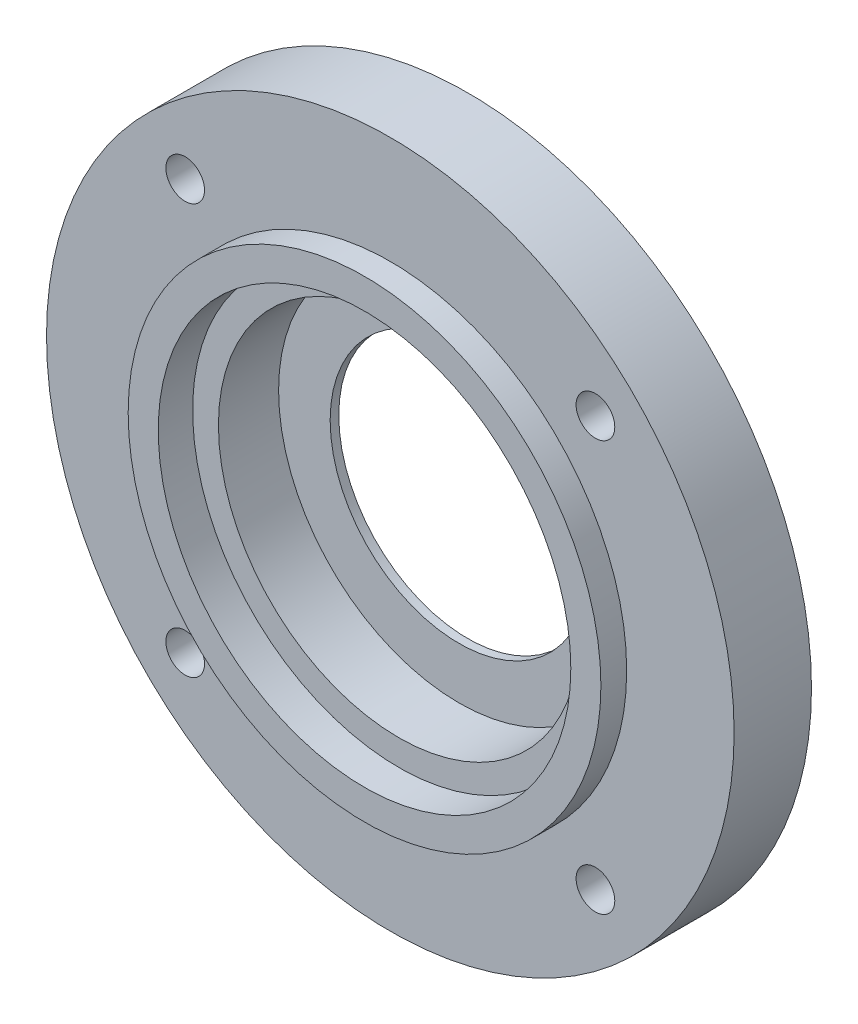
ISO-10303-21;
HEADER;
FILE_DESCRIPTION(('STEP AP214'),'2;1');
FILE_NAME('part.step','',(''),(''),'','','');
FILE_SCHEMA(('AUTOMOTIVE_DESIGN { 1 0 10303 214 1 1 1 1 }'));
ENDSEC;
DATA;
#1=APPLICATION_CONTEXT('core data for automotive mechanical design processes');
#2=APPLICATION_PROTOCOL_DEFINITION('international standard','automotive_design',2000,#1);
#3=PRODUCT_CONTEXT('',#1,'mechanical');
#4=PRODUCT('Part','Part','',(#3));
#5=PRODUCT_RELATED_PRODUCT_CATEGORY('part','',(#4));
#6=PRODUCT_DEFINITION_FORMATION('','',#4);
#7=PRODUCT_DEFINITION_CONTEXT('part definition',#1,'design');
#8=PRODUCT_DEFINITION('design','',#6,#7);
#9=PRODUCT_DEFINITION_SHAPE('','',#8);
#10=(LENGTH_UNIT() NAMED_UNIT(*) SI_UNIT(.MILLI.,.METRE.));
#11=(NAMED_UNIT(*) PLANE_ANGLE_UNIT() SI_UNIT($,.RADIAN.));
#12=(NAMED_UNIT(*) SI_UNIT($,.STERADIAN.) SOLID_ANGLE_UNIT());
#13=UNCERTAINTY_MEASURE_WITH_UNIT(LENGTH_MEASURE(1.E-05),#10,'distance_accuracy_value','');
#14=(GEOMETRIC_REPRESENTATION_CONTEXT(3) GLOBAL_UNCERTAINTY_ASSIGNED_CONTEXT((#13)) GLOBAL_UNIT_ASSIGNED_CONTEXT((#10,
#11,#12)) REPRESENTATION_CONTEXT('',''));
#15=CARTESIAN_POINT('',(0.,0.,0.));
#16=DIRECTION('',(0.,0.,1.));
#17=DIRECTION('',(1.,0.,0.));
#18=AXIS2_PLACEMENT_3D('',#15,#16,#17);
#19=CARTESIAN_POINT('',(0.,0.,150.));
#20=DIRECTION('',(0.,0.,1.));
#21=DIRECTION('',(1.,0.,0.));
#22=AXIS2_PLACEMENT_3D('',#19,#20,#21);
#23=CYLINDRICAL_SURFACE('',#22,15.);
#24=CARTESIAN_POINT('',(0.,0.,-104.));
#25=DIRECTION('',(0.,0.,1.));
#26=DIRECTION('',(1.,0.,0.));
#27=AXIS2_PLACEMENT_3D('',#24,#25,#26);
#28=CIRCLE('',#27,15.);
#29=CARTESIAN_POINT('',(15.,0.,-104.));
#30=VERTEX_POINT('',#29);
#31=EDGE_CURVE('E90',#30,#30,#28,.T.);
#32=ORIENTED_EDGE('',*,*,#31,.T.);
#33=EDGE_LOOP('',(#32));
#34=FACE_BOUND('',#33,.T.);
#35=CARTESIAN_POINT('',(0.,0.,-105.));
#36=DIRECTION('',(0.,0.,1.));
#37=DIRECTION('',(1.,0.,0.));
#38=AXIS2_PLACEMENT_3D('',#35,#36,#37);
#39=CIRCLE('',#38,15.);
#40=CARTESIAN_POINT('',(15.,0.,-105.));
#41=VERTEX_POINT('',#40);
#42=EDGE_CURVE('E10',#41,#41,#39,.T.);
#43=ORIENTED_EDGE('',*,*,#42,.F.);
#44=EDGE_LOOP('',(#43));
#45=FACE_BOUND('',#44,.T.);
#46=ADVANCED_FACE('F39',(#34,#45),#23,.F.);
#47=CARTESIAN_POINT('',(15.,0.,-105.));
#48=DIRECTION('',(0.,0.,-1.));
#49=DIRECTION('',(-1.,0.,0.));
#50=AXIS2_PLACEMENT_3D('',#47,#48,#49);
#51=PLANE('',#50);
#52=CARTESIAN_POINT('',(23.8649,-23.8649,-105.));
#53=DIRECTION('',(0.,0.,-1.));
#54=DIRECTION('',(-1.,0.,0.));
#55=AXIS2_PLACEMENT_3D('',#52,#53,#54);
#56=CIRCLE('',#55,2.25);
#57=CARTESIAN_POINT('',(21.6149,-23.8649,-105.));
#58=VERTEX_POINT('',#57);
#59=EDGE_CURVE('E83',#58,#58,#56,.F.);
#60=ORIENTED_EDGE('',*,*,#59,.T.);
#61=EDGE_LOOP('',(#60));
#62=FACE_BOUND('',#61,.T.);
#63=CARTESIAN_POINT('',(-23.8649,-23.8649,-105.));
#64=DIRECTION('',(0.,0.,-1.));
#65=DIRECTION('',(-1.,0.,0.));
#66=AXIS2_PLACEMENT_3D('',#63,#64,#65);
#67=CIRCLE('',#66,2.25);
#68=CARTESIAN_POINT('',(-26.1149,-23.8649,-105.));
#69=VERTEX_POINT('',#68);
#70=EDGE_CURVE('E68',#69,#69,#67,.F.);
#71=ORIENTED_EDGE('',*,*,#70,.T.);
#72=EDGE_LOOP('',(#71));
#73=FACE_BOUND('',#72,.T.);
#74=CARTESIAN_POINT('',(-23.8649,23.8649,-105.));
#75=DIRECTION('',(0.,0.,-1.));
#76=DIRECTION('',(-1.,0.,0.));
#77=AXIS2_PLACEMENT_3D('',#74,#75,#76);
#78=CIRCLE('',#77,2.25);
#79=CARTESIAN_POINT('',(-26.1149,23.8649,-105.));
#80=VERTEX_POINT('',#79);
#81=EDGE_CURVE('E67',#80,#80,#78,.F.);
#82=ORIENTED_EDGE('',*,*,#81,.T.);
#83=EDGE_LOOP('',(#82));
#84=FACE_BOUND('',#83,.T.);
#85=CARTESIAN_POINT('',(23.8649,23.8649,-105.));
#86=DIRECTION('',(0.,0.,-1.));
#87=DIRECTION('',(-1.,0.,0.));
#88=AXIS2_PLACEMENT_3D('',#85,#86,#87);
#89=CIRCLE('',#88,2.25);
#90=CARTESIAN_POINT('',(21.6149,23.8649,-105.));
#91=VERTEX_POINT('',#90);
#92=EDGE_CURVE('E64',#91,#91,#89,.F.);
#93=ORIENTED_EDGE('',*,*,#92,.T.);
#94=EDGE_LOOP('',(#93));
#95=FACE_BOUND('',#94,.T.);
#96=ORIENTED_EDGE('',*,*,#42,.T.);
#97=EDGE_LOOP('',(#96));
#98=FACE_BOUND('',#97,.T.);
#99=CARTESIAN_POINT('',(0.,0.,-105.));
#100=DIRECTION('',(0.,0.,1.));
#101=DIRECTION('',(1.,0.,0.));
#102=AXIS2_PLACEMENT_3D('',#99,#100,#101);
#103=CIRCLE('',#102,40.);
#104=CARTESIAN_POINT('',(40.,0.,-105.));
#105=VERTEX_POINT('',#104);
#106=EDGE_CURVE('E50',#105,#105,#103,.T.);
#107=ORIENTED_EDGE('',*,*,#106,.F.);
#108=EDGE_LOOP('',(#107));
#109=FACE_BOUND('',#108,.T.);
#110=ADVANCED_FACE('F127',(#62,#73,#84,#95,#98,#109),#51,.T.);
#111=CARTESIAN_POINT('',(0.,0.,150.));
#112=DIRECTION('',(0.,0.,1.));
#113=DIRECTION('',(1.,0.,0.));
#114=AXIS2_PLACEMENT_3D('',#111,#112,#113);
#115=CYLINDRICAL_SURFACE('',#114,40.);
#116=ORIENTED_EDGE('',*,*,#106,.T.);
#117=EDGE_LOOP('',(#116));
#118=FACE_BOUND('',#117,.T.);
#119=CARTESIAN_POINT('',(0.,0.,-96.));
#120=DIRECTION('',(0.,0.,1.));
#121=DIRECTION('',(1.,0.,0.));
#122=AXIS2_PLACEMENT_3D('',#119,#120,#121);
#123=CIRCLE('',#122,40.);
#124=CARTESIAN_POINT('',(40.,0.,-96.));
#125=VERTEX_POINT('',#124);
#126=EDGE_CURVE('E53',#125,#125,#123,.T.);
#127=ORIENTED_EDGE('',*,*,#126,.F.);
#128=EDGE_LOOP('',(#127));
#129=FACE_BOUND('',#128,.T.);
#130=ADVANCED_FACE('F121',(#118,#129),#115,.T.);
#131=CARTESIAN_POINT('',(40.,0.,-96.));
#132=DIRECTION('',(0.,0.,1.));
#133=DIRECTION('',(1.,0.,0.));
#134=AXIS2_PLACEMENT_3D('',#131,#132,#133);
#135=PLANE('',#134);
#136=CARTESIAN_POINT('',(23.8649,-23.8649,-96.));
#137=DIRECTION('',(0.,0.,1.));
#138=DIRECTION('',(1.,0.,0.));
#139=AXIS2_PLACEMENT_3D('',#136,#137,#138);
#140=CIRCLE('',#139,2.25);
#141=CARTESIAN_POINT('',(26.1149,-23.8649,-96.));
#142=VERTEX_POINT('',#141);
#143=EDGE_CURVE('E45',#142,#142,#140,.F.);
#144=ORIENTED_EDGE('',*,*,#143,.T.);
#145=EDGE_LOOP('',(#144));
#146=FACE_BOUND('',#145,.T.);
#147=CARTESIAN_POINT('',(-23.8649,-23.8649,-96.));
#148=DIRECTION('',(0.,0.,1.));
#149=DIRECTION('',(1.,0.,0.));
#150=AXIS2_PLACEMENT_3D('',#147,#148,#149);
#151=CIRCLE('',#150,2.25);
#152=CARTESIAN_POINT('',(-21.6149,-23.8649,-96.));
#153=VERTEX_POINT('',#152);
#154=EDGE_CURVE('E69',#153,#153,#151,.F.);
#155=ORIENTED_EDGE('',*,*,#154,.T.);
#156=EDGE_LOOP('',(#155));
#157=FACE_BOUND('',#156,.T.);
#158=CARTESIAN_POINT('',(-23.8649,23.8649,-96.));
#159=DIRECTION('',(0.,0.,1.));
#160=DIRECTION('',(1.,0.,0.));
#161=AXIS2_PLACEMENT_3D('',#158,#159,#160);
#162=CIRCLE('',#161,2.25);
#163=CARTESIAN_POINT('',(-21.6149,23.8649,-96.));
#164=VERTEX_POINT('',#163);
#165=EDGE_CURVE('E65',#164,#164,#162,.F.);
#166=ORIENTED_EDGE('',*,*,#165,.T.);
#167=EDGE_LOOP('',(#166));
#168=FACE_BOUND('',#167,.T.);
#169=CARTESIAN_POINT('',(23.8649,23.8649,-96.));
#170=DIRECTION('',(0.,0.,1.));
#171=DIRECTION('',(1.,0.,0.));
#172=AXIS2_PLACEMENT_3D('',#169,#170,#171);
#173=CIRCLE('',#172,2.25);
#174=CARTESIAN_POINT('',(26.1149,23.8649,-96.));
#175=VERTEX_POINT('',#174);
#176=EDGE_CURVE('E59',#175,#175,#173,.F.);
#177=ORIENTED_EDGE('',*,*,#176,.T.);
#178=EDGE_LOOP('',(#177));
#179=FACE_BOUND('',#178,.T.);
#180=ORIENTED_EDGE('',*,*,#126,.T.);
#181=EDGE_LOOP('',(#180));
#182=FACE_BOUND('',#181,.T.);
#183=CARTESIAN_POINT('',(0.,0.,-96.));
#184=DIRECTION('',(0.,0.,1.));
#185=DIRECTION('',(1.,0.,0.));
#186=AXIS2_PLACEMENT_3D('',#183,#184,#185);
#187=CIRCLE('',#186,27.5);
#188=CARTESIAN_POINT('',(27.5,0.,-96.));
#189=VERTEX_POINT('',#188);
#190=EDGE_CURVE('E114',#189,#189,#187,.T.);
#191=ORIENTED_EDGE('',*,*,#190,.F.);
#192=EDGE_LOOP('',(#191));
#193=FACE_BOUND('',#192,.T.);
#194=ADVANCED_FACE('F122',(#146,#157,#168,#179,#182,#193),#135,.T.);
#195=CARTESIAN_POINT('',(0.,0.,150.));
#196=DIRECTION('',(0.,0.,1.));
#197=DIRECTION('',(1.,0.,0.));
#198=AXIS2_PLACEMENT_3D('',#195,#196,#197);
#199=CYLINDRICAL_SURFACE('',#198,27.5);
#200=ORIENTED_EDGE('',*,*,#190,.T.);
#201=EDGE_LOOP('',(#200));
#202=FACE_BOUND('',#201,.T.);
#203=CARTESIAN_POINT('',(0.,0.,-93.));
#204=DIRECTION('',(0.,0.,1.));
#205=DIRECTION('',(1.,0.,0.));
#206=AXIS2_PLACEMENT_3D('',#203,#204,#205);
#207=CIRCLE('',#206,27.5);
#208=CARTESIAN_POINT('',(27.5,0.,-93.));
#209=VERTEX_POINT('',#208);
#210=EDGE_CURVE('E108',#209,#209,#207,.T.);
#211=ORIENTED_EDGE('',*,*,#210,.F.);
#212=EDGE_LOOP('',(#211));
#213=FACE_BOUND('',#212,.T.);
#214=ADVANCED_FACE('F131',(#202,#213),#199,.T.);
#215=CARTESIAN_POINT('',(27.5,0.,-93.));
#216=DIRECTION('',(0.,0.,1.));
#217=DIRECTION('',(1.,0.,0.));
#218=AXIS2_PLACEMENT_3D('',#215,#216,#217);
#219=PLANE('',#218);
#220=ORIENTED_EDGE('',*,*,#210,.T.);
#221=EDGE_LOOP('',(#220));
#222=FACE_BOUND('',#221,.T.);
#223=CARTESIAN_POINT('',(0.,0.,-93.));
#224=DIRECTION('',(0.,0.,1.));
#225=DIRECTION('',(1.,0.,0.));
#226=AXIS2_PLACEMENT_3D('',#223,#224,#225);
#227=CIRCLE('',#226,24.);
#228=CARTESIAN_POINT('',(24.,0.,-93.));
#229=VERTEX_POINT('',#228);
#230=EDGE_CURVE('E104',#229,#229,#227,.T.);
#231=ORIENTED_EDGE('',*,*,#230,.F.);
#232=EDGE_LOOP('',(#231));
#233=FACE_BOUND('',#232,.T.);
#234=ADVANCED_FACE('F166',(#222,#233),#219,.T.);
#235=CARTESIAN_POINT('',(0.,0.,150.));
#236=DIRECTION('',(0.,0.,1.));
#237=DIRECTION('',(1.,0.,0.));
#238=AXIS2_PLACEMENT_3D('',#235,#236,#237);
#239=CYLINDRICAL_SURFACE('',#238,24.);
#240=ORIENTED_EDGE('',*,*,#230,.T.);
#241=EDGE_LOOP('',(#240));
#242=FACE_BOUND('',#241,.T.);
#243=CARTESIAN_POINT('',(0.,0.,-97.));
#244=DIRECTION('',(0.,0.,1.));
#245=DIRECTION('',(1.,0.,0.));
#246=AXIS2_PLACEMENT_3D('',#243,#244,#245);
#247=CIRCLE('',#246,24.);
#248=CARTESIAN_POINT('',(24.,0.,-97.));
#249=VERTEX_POINT('',#248);
#250=EDGE_CURVE('E101',#249,#249,#247,.T.);
#251=ORIENTED_EDGE('',*,*,#250,.F.);
#252=EDGE_LOOP('',(#251));
#253=FACE_BOUND('',#252,.T.);
#254=ADVANCED_FACE('F164',(#242,#253),#239,.F.);
#255=CARTESIAN_POINT('',(24.,0.,-97.));
#256=DIRECTION('',(0.,0.,1.));
#257=DIRECTION('',(1.,0.,0.));
#258=AXIS2_PLACEMENT_3D('',#255,#256,#257);
#259=PLANE('',#258);
#260=ORIENTED_EDGE('',*,*,#250,.T.);
#261=EDGE_LOOP('',(#260));
#262=FACE_BOUND('',#261,.T.);
#263=CARTESIAN_POINT('',(0.,0.,-97.));
#264=DIRECTION('',(0.,0.,1.));
#265=DIRECTION('',(1.,0.,0.));
#266=AXIS2_PLACEMENT_3D('',#263,#264,#265);
#267=CIRCLE('',#266,21.);
#268=CARTESIAN_POINT('',(21.,0.,-97.));
#269=VERTEX_POINT('',#268);
#270=EDGE_CURVE('E100',#269,#269,#267,.T.);
#271=ORIENTED_EDGE('',*,*,#270,.F.);
#272=EDGE_LOOP('',(#271));
#273=FACE_BOUND('',#272,.T.);
#274=ADVANCED_FACE('F158',(#262,#273),#259,.T.);
#275=CARTESIAN_POINT('',(0.,0.,150.));
#276=DIRECTION('',(0.,0.,1.));
#277=DIRECTION('',(1.,0.,0.));
#278=AXIS2_PLACEMENT_3D('',#275,#276,#277);
#279=CYLINDRICAL_SURFACE('',#278,21.);
#280=ORIENTED_EDGE('',*,*,#270,.T.);
#281=EDGE_LOOP('',(#280));
#282=FACE_BOUND('',#281,.T.);
#283=CARTESIAN_POINT('',(0.,0.,-104.));
#284=DIRECTION('',(0.,0.,1.));
#285=DIRECTION('',(1.,0.,0.));
#286=AXIS2_PLACEMENT_3D('',#283,#284,#285);
#287=CIRCLE('',#286,21.);
#288=CARTESIAN_POINT('',(21.,0.,-104.));
#289=VERTEX_POINT('',#288);
#290=EDGE_CURVE('E91',#289,#289,#287,.T.);
#291=ORIENTED_EDGE('',*,*,#290,.F.);
#292=EDGE_LOOP('',(#291));
#293=FACE_BOUND('',#292,.T.);
#294=ADVANCED_FACE('F146',(#282,#293),#279,.F.);
#295=CARTESIAN_POINT('',(21.,0.,-104.));
#296=DIRECTION('',(0.,0.,1.));
#297=DIRECTION('',(1.,0.,0.));
#298=AXIS2_PLACEMENT_3D('',#295,#296,#297);
#299=PLANE('',#298);
#300=ORIENTED_EDGE('',*,*,#290,.T.);
#301=EDGE_LOOP('',(#300));
#302=FACE_BOUND('',#301,.T.);
#303=ORIENTED_EDGE('',*,*,#31,.F.);
#304=EDGE_LOOP('',(#303));
#305=FACE_BOUND('',#304,.T.);
#306=ADVANCED_FACE('F144',(#302,#305),#299,.T.);
#307=CARTESIAN_POINT('',(23.8649,23.8649,150.));
#308=DIRECTION('',(0.,0.,-1.));
#309=DIRECTION('',(-1.,0.,0.));
#310=AXIS2_PLACEMENT_3D('',#307,#308,#309);
#311=CYLINDRICAL_SURFACE('',#310,2.25);
#312=ORIENTED_EDGE('',*,*,#92,.F.);
#313=EDGE_LOOP('',(#312));
#314=FACE_BOUND('',#313,.T.);
#315=ORIENTED_EDGE('',*,*,#176,.F.);
#316=EDGE_LOOP('',(#315));
#317=FACE_BOUND('',#316,.T.);
#318=ADVANCED_FACE('F150',(#314,#317),#311,.F.);
#319=CARTESIAN_POINT('',(-23.8649,23.8649,150.));
#320=DIRECTION('',(0.,0.,-1.));
#321=DIRECTION('',(-1.,0.,0.));
#322=AXIS2_PLACEMENT_3D('',#319,#320,#321);
#323=CYLINDRICAL_SURFACE('',#322,2.25);
#324=ORIENTED_EDGE('',*,*,#81,.F.);
#325=EDGE_LOOP('',(#324));
#326=FACE_BOUND('',#325,.T.);
#327=ORIENTED_EDGE('',*,*,#165,.F.);
#328=EDGE_LOOP('',(#327));
#329=FACE_BOUND('',#328,.T.);
#330=ADVANCED_FACE('F154',(#326,#329),#323,.F.);
#331=CARTESIAN_POINT('',(-23.8649,-23.8649,150.));
#332=DIRECTION('',(0.,0.,-1.));
#333=DIRECTION('',(-1.,0.,0.));
#334=AXIS2_PLACEMENT_3D('',#331,#332,#333);
#335=CYLINDRICAL_SURFACE('',#334,2.25);
#336=ORIENTED_EDGE('',*,*,#70,.F.);
#337=EDGE_LOOP('',(#336));
#338=FACE_BOUND('',#337,.T.);
#339=ORIENTED_EDGE('',*,*,#154,.F.);
#340=EDGE_LOOP('',(#339));
#341=FACE_BOUND('',#340,.T.);
#342=ADVANCED_FACE('F226',(#338,#341),#335,.F.);
#343=CARTESIAN_POINT('',(23.8649,-23.8649,150.));
#344=DIRECTION('',(0.,0.,-1.));
#345=DIRECTION('',(-1.,0.,0.));
#346=AXIS2_PLACEMENT_3D('',#343,#344,#345);
#347=CYLINDRICAL_SURFACE('',#346,2.25);
#348=ORIENTED_EDGE('',*,*,#59,.F.);
#349=EDGE_LOOP('',(#348));
#350=FACE_BOUND('',#349,.T.);
#351=ORIENTED_EDGE('',*,*,#143,.F.);
#352=EDGE_LOOP('',(#351));
#353=FACE_BOUND('',#352,.T.);
#354=ADVANCED_FACE('F239',(#350,#353),#347,.F.);
#355=CLOSED_SHELL('',(#46,#110,#130,#194,#214,#234,#254,#274,#294,#306,#318,#330,#342,#354));
#356=MANIFOLD_SOLID_BREP('B2',#355);
#357=ADVANCED_BREP_SHAPE_REPRESENTATION('',(#18,#356),#14);
#358=SHAPE_DEFINITION_REPRESENTATION(#9,#357);
ENDSEC;
END-ISO-10303-21;
